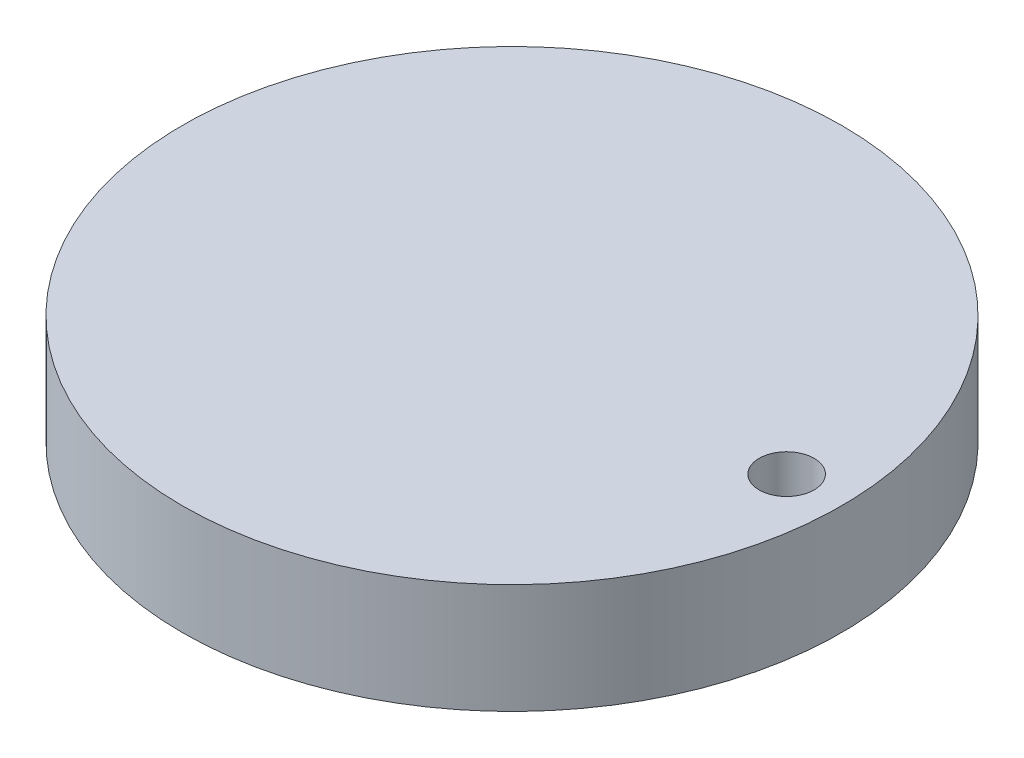
ISO-10303-21;
HEADER;
FILE_DESCRIPTION(('STEP AP214'),'2;1');
FILE_NAME('part.step','',(''),(''),'','','');
FILE_SCHEMA(('AUTOMOTIVE_DESIGN { 1 0 10303 214 1 1 1 1 }'));
ENDSEC;
DATA;
#1=APPLICATION_CONTEXT('core data for automotive mechanical design processes');
#2=APPLICATION_PROTOCOL_DEFINITION('international standard','automotive_design',2000,#1);
#3=PRODUCT_CONTEXT('',#1,'mechanical');
#4=PRODUCT('Part','Part','',(#3));
#5=PRODUCT_RELATED_PRODUCT_CATEGORY('part','',(#4));
#6=PRODUCT_DEFINITION_FORMATION('','',#4);
#7=PRODUCT_DEFINITION_CONTEXT('part definition',#1,'design');
#8=PRODUCT_DEFINITION('design','',#6,#7);
#9=PRODUCT_DEFINITION_SHAPE('','',#8);
#10=(LENGTH_UNIT() NAMED_UNIT(*) SI_UNIT(.MILLI.,.METRE.));
#11=(NAMED_UNIT(*) PLANE_ANGLE_UNIT() SI_UNIT($,.RADIAN.));
#12=(NAMED_UNIT(*) SI_UNIT($,.STERADIAN.) SOLID_ANGLE_UNIT());
#13=UNCERTAINTY_MEASURE_WITH_UNIT(LENGTH_MEASURE(1.E-05),#10,'distance_accuracy_value','');
#14=(GEOMETRIC_REPRESENTATION_CONTEXT(3) GLOBAL_UNCERTAINTY_ASSIGNED_CONTEXT((#13)) GLOBAL_UNIT_ASSIGNED_CONTEXT((#10,
#11,#12)) REPRESENTATION_CONTEXT('',''));
#15=CARTESIAN_POINT('',(0.,0.,0.));
#16=DIRECTION('',(0.,0.,1.));
#17=DIRECTION('',(1.,0.,0.));
#18=AXIS2_PLACEMENT_3D('',#15,#16,#17);
#19=CARTESIAN_POINT('',(0.,10.,0.));
#20=DIRECTION('',(0.,-1.,0.));
#21=DIRECTION('',(0.,0.,-1.));
#22=AXIS2_PLACEMENT_3D('',#19,#20,#21);
#23=CYLINDRICAL_SURFACE('',#22,30.);
#24=CARTESIAN_POINT('',(0.,10.,0.));
#25=DIRECTION('',(0.,1.,0.));
#26=DIRECTION('',(0.,0.,1.));
#27=AXIS2_PLACEMENT_3D('',#24,#25,#26);
#28=CIRCLE('',#27,30.);
#29=CARTESIAN_POINT('',(0.,10.,30.));
#30=VERTEX_POINT('',#29);
#31=EDGE_CURVE('E10',#30,#30,#28,.T.);
#32=ORIENTED_EDGE('',*,*,#31,.F.);
#33=EDGE_LOOP('',(#32));
#34=FACE_BOUND('',#33,.T.);
#35=CARTESIAN_POINT('',(0.,0.,0.));
#36=DIRECTION('',(0.,1.,0.));
#37=DIRECTION('',(0.,0.,1.));
#38=AXIS2_PLACEMENT_3D('',#35,#36,#37);
#39=CIRCLE('',#38,30.);
#40=CARTESIAN_POINT('',(0.,0.,30.));
#41=VERTEX_POINT('',#40);
#42=EDGE_CURVE('E40',#41,#41,#39,.T.);
#43=ORIENTED_EDGE('',*,*,#42,.T.);
#44=EDGE_LOOP('',(#43));
#45=FACE_BOUND('',#44,.T.);
#46=ADVANCED_FACE('F37',(#34,#45),#23,.T.);
#47=CARTESIAN_POINT('',(0.,10.,0.));
#48=DIRECTION('',(0.,1.,0.));
#49=DIRECTION('',(0.,0.,1.));
#50=AXIS2_PLACEMENT_3D('',#47,#48,#49);
#51=PLANE('',#50);
#52=CARTESIAN_POINT('',(25.,10.,0.));
#53=DIRECTION('',(0.,1.,0.));
#54=DIRECTION('',(0.,0.,1.));
#55=AXIS2_PLACEMENT_3D('',#52,#53,#54);
#56=CIRCLE('',#55,2.5);
#57=CARTESIAN_POINT('',(25.,10.,2.5));
#58=VERTEX_POINT('',#57);
#59=EDGE_CURVE('E59',#58,#58,#56,.T.);
#60=ORIENTED_EDGE('',*,*,#59,.F.);
#61=EDGE_LOOP('',(#60));
#62=FACE_BOUND('',#61,.T.);
#63=ORIENTED_EDGE('',*,*,#31,.T.);
#64=EDGE_LOOP('',(#63));
#65=FACE_BOUND('',#64,.T.);
#66=ADVANCED_FACE('F76',(#62,#65),#51,.T.);
#67=CARTESIAN_POINT('',(0.,0.,0.));
#68=DIRECTION('',(0.,1.,0.));
#69=DIRECTION('',(0.,0.,1.));
#70=AXIS2_PLACEMENT_3D('',#67,#68,#69);
#71=PLANE('',#70);
#72=CARTESIAN_POINT('',(0.,0.,0.));
#73=DIRECTION('',(0.,-1.,0.));
#74=DIRECTION('',(0.,0.,-1.));
#75=AXIS2_PLACEMENT_3D('',#72,#73,#74);
#76=CIRCLE('',#75,4.25);
#77=CARTESIAN_POINT('',(0.,0.,-4.25));
#78=VERTEX_POINT('',#77);
#79=EDGE_CURVE('E51',#78,#78,#76,.T.);
#80=ORIENTED_EDGE('',*,*,#79,.F.);
#81=EDGE_LOOP('',(#80));
#82=FACE_BOUND('',#81,.T.);
#83=ORIENTED_EDGE('',*,*,#42,.F.);
#84=EDGE_LOOP('',(#83));
#85=FACE_BOUND('',#84,.T.);
#86=ADVANCED_FACE('F78',(#82,#85),#71,.F.);
#87=CARTESIAN_POINT('',(0.,7.,0.));
#88=DIRECTION('',(0.,-1.,0.));
#89=DIRECTION('',(0.,0.,-1.));
#90=AXIS2_PLACEMENT_3D('',#87,#88,#89);
#91=CYLINDRICAL_SURFACE('',#90,4.25);
#92=CARTESIAN_POINT('',(0.,7.,0.));
#93=DIRECTION('',(0.,-1.,0.));
#94=DIRECTION('',(0.,0.,-1.));
#95=AXIS2_PLACEMENT_3D('',#92,#93,#94);
#96=CIRCLE('',#95,4.25);
#97=CARTESIAN_POINT('',(0.,7.,-4.25));
#98=VERTEX_POINT('',#97);
#99=EDGE_CURVE('E49',#98,#98,#96,.T.);
#100=ORIENTED_EDGE('',*,*,#99,.F.);
#101=EDGE_LOOP('',(#100));
#102=FACE_BOUND('',#101,.T.);
#103=ORIENTED_EDGE('',*,*,#79,.T.);
#104=EDGE_LOOP('',(#103));
#105=FACE_BOUND('',#104,.T.);
#106=ADVANCED_FACE('F84',(#102,#105),#91,.F.);
#107=CARTESIAN_POINT('',(0.,7.,0.));
#108=DIRECTION('',(0.,-1.,0.));
#109=DIRECTION('',(0.,0.,-1.));
#110=AXIS2_PLACEMENT_3D('',#107,#108,#109);
#111=PLANE('',#110);
#112=ORIENTED_EDGE('',*,*,#99,.T.);
#113=EDGE_LOOP('',(#112));
#114=FACE_BOUND('',#113,.T.);
#115=ADVANCED_FACE('F72',(#114),#111,.T.);
#116=CARTESIAN_POINT('',(25.,4.,0.));
#117=DIRECTION('',(0.,1.,0.));
#118=DIRECTION('',(0.,0.,1.));
#119=AXIS2_PLACEMENT_3D('',#116,#117,#118);
#120=CYLINDRICAL_SURFACE('',#119,2.5);
#121=CARTESIAN_POINT('',(25.,4.,0.));
#122=DIRECTION('',(0.,1.,0.));
#123=DIRECTION('',(0.,0.,1.));
#124=AXIS2_PLACEMENT_3D('',#121,#122,#123);
#125=CIRCLE('',#124,2.5);
#126=CARTESIAN_POINT('',(25.,4.,2.5));
#127=VERTEX_POINT('',#126);
#128=EDGE_CURVE('E55',#127,#127,#125,.T.);
#129=ORIENTED_EDGE('',*,*,#128,.F.);
#130=EDGE_LOOP('',(#129));
#131=FACE_BOUND('',#130,.T.);
#132=ORIENTED_EDGE('',*,*,#59,.T.);
#133=EDGE_LOOP('',(#132));
#134=FACE_BOUND('',#133,.T.);
#135=ADVANCED_FACE('F69',(#131,#134),#120,.F.);
#136=CARTESIAN_POINT('',(25.,4.,0.));
#137=DIRECTION('',(0.,1.,0.));
#138=DIRECTION('',(0.,0.,1.));
#139=AXIS2_PLACEMENT_3D('',#136,#137,#138);
#140=PLANE('',#139);
#141=ORIENTED_EDGE('',*,*,#128,.T.);
#142=EDGE_LOOP('',(#141));
#143=FACE_BOUND('',#142,.T.);
#144=ADVANCED_FACE('F67',(#143),#140,.T.);
#145=CLOSED_SHELL('',(#46,#66,#86,#106,#115,#135,#144));
#146=MANIFOLD_SOLID_BREP('B2',#145);
#147=ADVANCED_BREP_SHAPE_REPRESENTATION('',(#18,#146),#14);
#148=SHAPE_DEFINITION_REPRESENTATION(#9,#147);
ENDSEC;
END-ISO-10303-21;
